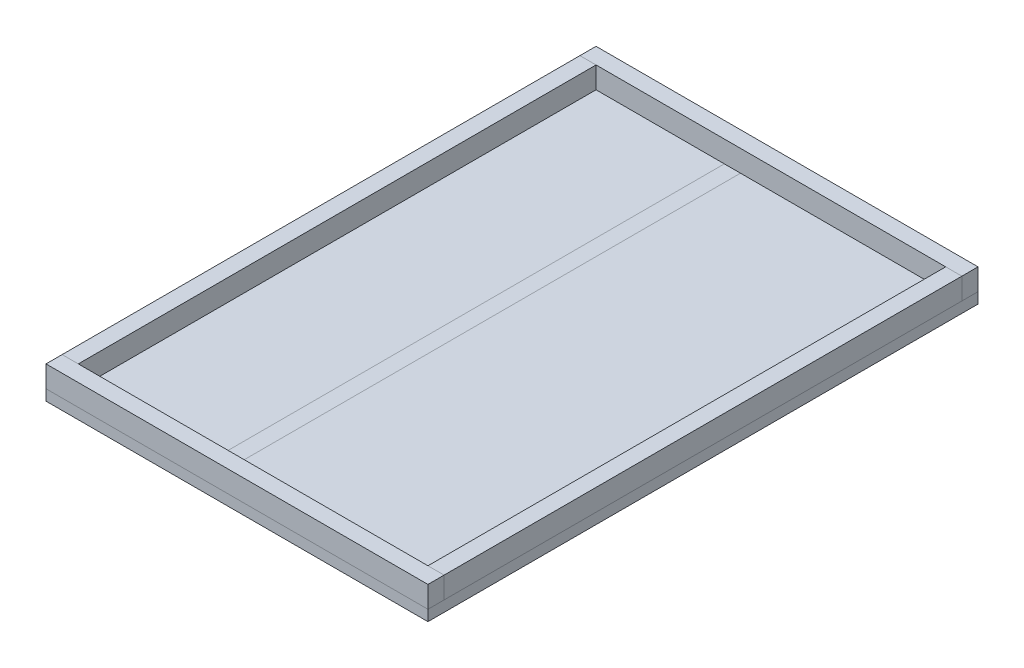
ISO-10303-21;
HEADER;
FILE_DESCRIPTION(('STEP AP214'),'2;1');
FILE_NAME('part.step','',(''),(''),'','','');
FILE_SCHEMA(('AUTOMOTIVE_DESIGN { 1 0 10303 214 1 1 1 1 }'));
ENDSEC;
DATA;
#1=APPLICATION_CONTEXT('core data for automotive mechanical design processes');
#2=APPLICATION_PROTOCOL_DEFINITION('international standard','automotive_design',2000,#1);
#3=PRODUCT_CONTEXT('',#1,'mechanical');
#4=PRODUCT('Part','Part','',(#3));
#5=PRODUCT_RELATED_PRODUCT_CATEGORY('part','',(#4));
#6=PRODUCT_DEFINITION_FORMATION('','',#4);
#7=PRODUCT_DEFINITION_CONTEXT('part definition',#1,'design');
#8=PRODUCT_DEFINITION('design','',#6,#7);
#9=PRODUCT_DEFINITION_SHAPE('','',#8);
#10=(LENGTH_UNIT() NAMED_UNIT(*) SI_UNIT(.MILLI.,.METRE.));
#11=(NAMED_UNIT(*) PLANE_ANGLE_UNIT() SI_UNIT($,.RADIAN.));
#12=(NAMED_UNIT(*) SI_UNIT($,.STERADIAN.) SOLID_ANGLE_UNIT());
#13=UNCERTAINTY_MEASURE_WITH_UNIT(LENGTH_MEASURE(1.E-05),#10,'distance_accuracy_value','');
#14=(GEOMETRIC_REPRESENTATION_CONTEXT(3) GLOBAL_UNCERTAINTY_ASSIGNED_CONTEXT((#13)) GLOBAL_UNIT_ASSIGNED_CONTEXT((#10,
#11,#12)) REPRESENTATION_CONTEXT('',''));
#15=CARTESIAN_POINT('',(0.,0.,0.));
#16=DIRECTION('',(0.,0.,1.));
#17=DIRECTION('',(1.,0.,0.));
#18=AXIS2_PLACEMENT_3D('',#15,#16,#17);
#19=CARTESIAN_POINT('',(-35.8750000000001,-9.525,305.55));
#20=DIRECTION('',(1.,0.,0.));
#21=DIRECTION('',(0.,0.,-1.));
#22=AXIS2_PLACEMENT_3D('',#19,#20,#21);
#23=PLANE('',#22);
#24=DIRECTION('',(0.,0.,-1.));
#25=VECTOR('',#24,1.);
#26=CARTESIAN_POINT('',(-35.8750000000001,0.,305.55));
#27=LINE('',#26,#25);
#28=CARTESIAN_POINT('',(-35.8750000000001,0.,305.55));
#29=VERTEX_POINT('',#28);
#30=CARTESIAN_POINT('',(-35.8750000000001,0.,-305.55));
#31=VERTEX_POINT('',#30);
#32=EDGE_CURVE('E142',#29,#31,#27,.T.);
#33=ORIENTED_EDGE('',*,*,#32,.F.);
#34=DIRECTION('',(0.,1.,0.));
#35=VECTOR('',#34,1.);
#36=CARTESIAN_POINT('',(-35.8750000000001,-9.525,305.55));
#37=LINE('',#36,#35);
#38=CARTESIAN_POINT('',(-35.8750000000001,-9.525,305.55));
#39=VERTEX_POINT('',#38);
#40=EDGE_CURVE('E13',#39,#29,#37,.T.);
#41=ORIENTED_EDGE('',*,*,#40,.F.);
#42=DIRECTION('',(0.,0.,-1.));
#43=VECTOR('',#42,1.);
#44=CARTESIAN_POINT('',(-35.8750000000001,-9.525,305.55));
#45=LINE('',#44,#43);
#46=CARTESIAN_POINT('',(-35.8750000000001,-9.525,-305.55));
#47=VERTEX_POINT('',#46);
#48=EDGE_CURVE('E136',#39,#47,#45,.T.);
#49=ORIENTED_EDGE('',*,*,#48,.T.);
#50=DIRECTION('',(0.,1.,0.));
#51=VECTOR('',#50,1.);
#52=CARTESIAN_POINT('',(-35.8750000000001,-9.525,-305.55));
#53=LINE('',#52,#51);
#54=EDGE_CURVE('E81',#47,#31,#53,.T.);
#55=ORIENTED_EDGE('',*,*,#54,.T.);
#56=EDGE_LOOP('',(#33,#41,#49,#55));
#57=FACE_BOUND('',#56,.T.);
#58=ADVANCED_FACE('F78',(#57),#23,.T.);
#59=CARTESIAN_POINT('',(-54.9250000000001,-9.525,305.55));
#60=DIRECTION('',(0.,0.,1.));
#61=DIRECTION('',(1.,0.,0.));
#62=AXIS2_PLACEMENT_3D('',#59,#60,#61);
#63=PLANE('',#62);
#64=DIRECTION('',(1.,0.,0.));
#65=VECTOR('',#64,1.);
#66=CARTESIAN_POINT('',(-54.9250000000001,0.,305.55));
#67=LINE('',#66,#65);
#68=CARTESIAN_POINT('',(-54.9250000000001,0.,305.55));
#69=VERTEX_POINT('',#68);
#70=EDGE_CURVE('E138',#69,#29,#67,.T.);
#71=ORIENTED_EDGE('',*,*,#70,.F.);
#72=DIRECTION('',(0.,1.,0.));
#73=VECTOR('',#72,1.);
#74=CARTESIAN_POINT('',(-54.9250000000001,-9.525,305.55));
#75=LINE('',#74,#73);
#76=CARTESIAN_POINT('',(-54.9250000000001,-9.525,305.55));
#77=VERTEX_POINT('',#76);
#78=EDGE_CURVE('E87',#77,#69,#75,.T.);
#79=ORIENTED_EDGE('',*,*,#78,.F.);
#80=DIRECTION('',(1.,0.,0.));
#81=VECTOR('',#80,1.);
#82=CARTESIAN_POINT('',(-54.9250000000001,-9.525,305.55));
#83=LINE('',#82,#81);
#84=EDGE_CURVE('E133',#77,#39,#83,.T.);
#85=ORIENTED_EDGE('',*,*,#84,.T.);
#86=ORIENTED_EDGE('',*,*,#40,.T.);
#87=EDGE_LOOP('',(#71,#79,#85,#86));
#88=FACE_BOUND('',#87,.T.);
#89=ADVANCED_FACE('F152',(#88),#63,.T.);
#90=CARTESIAN_POINT('',(-54.9250000000001,-9.525,305.55));
#91=DIRECTION('',(-1.,0.,0.));
#92=DIRECTION('',(0.,0.,1.));
#93=AXIS2_PLACEMENT_3D('',#90,#91,#92);
#94=PLANE('',#93);
#95=DIRECTION('',(0.,0.,1.));
#96=VECTOR('',#95,1.);
#97=CARTESIAN_POINT('',(-54.9250000000001,0.,305.55));
#98=LINE('',#97,#96);
#99=CARTESIAN_POINT('',(-54.9250000000001,0.,-305.55));
#100=VERTEX_POINT('',#99);
#101=EDGE_CURVE('E128',#100,#69,#98,.T.);
#102=ORIENTED_EDGE('',*,*,#101,.F.);
#103=DIRECTION('',(0.,1.,0.));
#104=VECTOR('',#103,1.);
#105=CARTESIAN_POINT('',(-54.9250000000001,-9.525,-305.55));
#106=LINE('',#105,#104);
#107=CARTESIAN_POINT('',(-54.9250000000001,-9.525,-305.55));
#108=VERTEX_POINT('',#107);
#109=EDGE_CURVE('E123',#108,#100,#106,.T.);
#110=ORIENTED_EDGE('',*,*,#109,.F.);
#111=DIRECTION('',(0.,0.,1.));
#112=VECTOR('',#111,1.);
#113=CARTESIAN_POINT('',(-54.9250000000001,-9.525,305.55));
#114=LINE('',#113,#112);
#115=EDGE_CURVE('E126',#108,#77,#114,.T.);
#116=ORIENTED_EDGE('',*,*,#115,.T.);
#117=ORIENTED_EDGE('',*,*,#78,.T.);
#118=EDGE_LOOP('',(#102,#110,#116,#117));
#119=FACE_BOUND('',#118,.T.);
#120=ADVANCED_FACE('F125',(#119),#94,.T.);
#121=CARTESIAN_POINT('',(-54.9250000000001,-9.525,-305.55));
#122=DIRECTION('',(0.,0.,-1.));
#123=DIRECTION('',(-1.,0.,0.));
#124=AXIS2_PLACEMENT_3D('',#121,#122,#123);
#125=PLANE('',#124);
#126=DIRECTION('',(-1.,0.,0.));
#127=VECTOR('',#126,1.);
#128=CARTESIAN_POINT('',(-54.9250000000001,0.,-305.55));
#129=LINE('',#128,#127);
#130=EDGE_CURVE('E145',#31,#100,#129,.T.);
#131=ORIENTED_EDGE('',*,*,#130,.F.);
#132=ORIENTED_EDGE('',*,*,#54,.F.);
#133=DIRECTION('',(-1.,0.,0.));
#134=VECTOR('',#133,1.);
#135=CARTESIAN_POINT('',(-54.9250000000001,-9.525,-305.55));
#136=LINE('',#135,#134);
#137=EDGE_CURVE('E132',#47,#108,#136,.T.);
#138=ORIENTED_EDGE('',*,*,#137,.T.);
#139=ORIENTED_EDGE('',*,*,#109,.T.);
#140=EDGE_LOOP('',(#131,#132,#138,#139));
#141=FACE_BOUND('',#140,.T.);
#142=ADVANCED_FACE('F135',(#141),#125,.T.);
#143=CARTESIAN_POINT('',(0.,-9.525,0.));
#144=DIRECTION('',(0.,-1.,0.));
#145=DIRECTION('',(0.,0.,-1.));
#146=AXIS2_PLACEMENT_3D('',#143,#144,#145);
#147=PLANE('',#146);
#148=ORIENTED_EDGE('',*,*,#48,.F.);
#149=ORIENTED_EDGE('',*,*,#84,.F.);
#150=ORIENTED_EDGE('',*,*,#115,.F.);
#151=ORIENTED_EDGE('',*,*,#137,.F.);
#152=EDGE_LOOP('',(#148,#149,#150,#151));
#153=FACE_BOUND('',#152,.T.);
#154=ADVANCED_FACE('F131',(#153),#147,.T.);
#155=CARTESIAN_POINT('',(0.,0.,0.));
#156=DIRECTION('',(0.,-1.,0.));
#157=DIRECTION('',(0.,0.,-1.));
#158=AXIS2_PLACEMENT_3D('',#155,#156,#157);
#159=PLANE('',#158);
#160=ORIENTED_EDGE('',*,*,#32,.T.);
#161=ORIENTED_EDGE('',*,*,#130,.T.);
#162=ORIENTED_EDGE('',*,*,#101,.T.);
#163=ORIENTED_EDGE('',*,*,#70,.T.);
#164=EDGE_LOOP('',(#160,#161,#162,#163));
#165=FACE_BOUND('',#164,.T.);
#166=ADVANCED_FACE('F151',(#165),#159,.F.);
#167=CLOSED_SHELL('',(#58,#89,#120,#142,#154,#166));
#168=MANIFOLD_SOLID_BREP('B2',#167);
#169=CARTESIAN_POINT('',(5.39999999999993,-25.4,-305.55));
#170=DIRECTION('',(-1.,0.,0.));
#171=DIRECTION('',(0.,0.,1.));
#172=AXIS2_PLACEMENT_3D('',#169,#170,#171);
#173=PLANE('',#172);
#174=DIRECTION('',(0.,0.,1.));
#175=VECTOR('',#174,1.);
#176=CARTESIAN_POINT('',(5.39999999999993,-12.7,-305.55));
#177=LINE('',#176,#175);
#178=CARTESIAN_POINT('',(5.39999999999993,-12.7,-305.55));
#179=VERTEX_POINT('',#178);
#180=CARTESIAN_POINT('',(5.39999999999993,-12.7,305.55));
#181=VERTEX_POINT('',#180);
#182=EDGE_CURVE('E277',#179,#181,#177,.T.);
#183=ORIENTED_EDGE('',*,*,#182,.T.);
#184=DIRECTION('',(0.,1.,0.));
#185=VECTOR('',#184,1.);
#186=CARTESIAN_POINT('',(5.39999999999993,-25.4,305.55));
#187=LINE('',#186,#185);
#188=CARTESIAN_POINT('',(5.39999999999993,-25.4,305.55));
#189=VERTEX_POINT('',#188);
#190=EDGE_CURVE('E76',#189,#181,#187,.T.);
#191=ORIENTED_EDGE('',*,*,#190,.F.);
#192=DIRECTION('',(0.,0.,1.));
#193=VECTOR('',#192,1.);
#194=CARTESIAN_POINT('',(5.39999999999993,-25.4,-305.55));
#195=LINE('',#194,#193);
#196=CARTESIAN_POINT('',(5.39999999999993,-25.4,-305.55));
#197=VERTEX_POINT('',#196);
#198=EDGE_CURVE('E265',#197,#189,#195,.T.);
#199=ORIENTED_EDGE('',*,*,#198,.F.);
#200=DIRECTION('',(0.,1.,0.));
#201=VECTOR('',#200,1.);
#202=CARTESIAN_POINT('',(5.39999999999993,-25.4,-305.55));
#203=LINE('',#202,#201);
#204=EDGE_CURVE('E273',#197,#179,#203,.T.);
#205=ORIENTED_EDGE('',*,*,#204,.T.);
#206=EDGE_LOOP('',(#183,#191,#199,#205));
#207=FACE_BOUND('',#206,.T.);
#208=ADVANCED_FACE('F214',(#207),#173,.F.);
#209=CARTESIAN_POINT('',(-96.2000000000001,-25.4,305.55));
#210=DIRECTION('',(0.,0.,-1.));
#211=DIRECTION('',(-1.,0.,0.));
#212=AXIS2_PLACEMENT_3D('',#209,#210,#211);
#213=PLANE('',#212);
#214=DIRECTION('',(-1.,0.,0.));
#215=VECTOR('',#214,1.);
#216=CARTESIAN_POINT('',(-96.2000000000001,-12.7,305.55));
#217=LINE('',#216,#215);
#218=CARTESIAN_POINT('',(-96.2000000000001,-12.7,305.55));
#219=VERTEX_POINT('',#218);
#220=EDGE_CURVE('E269',#181,#219,#217,.T.);
#221=ORIENTED_EDGE('',*,*,#220,.T.);
#222=DIRECTION('',(0.,1.,0.));
#223=VECTOR('',#222,1.);
#224=CARTESIAN_POINT('',(-96.2000000000001,-25.4,305.55));
#225=LINE('',#224,#223);
#226=CARTESIAN_POINT('',(-96.2000000000001,-25.4,305.55));
#227=VERTEX_POINT('',#226);
#228=EDGE_CURVE('E222',#227,#219,#225,.T.);
#229=ORIENTED_EDGE('',*,*,#228,.F.);
#230=DIRECTION('',(-1.,0.,0.));
#231=VECTOR('',#230,1.);
#232=CARTESIAN_POINT('',(-96.2000000000001,-25.4,305.55));
#233=LINE('',#232,#231);
#234=EDGE_CURVE('E260',#189,#227,#233,.T.);
#235=ORIENTED_EDGE('',*,*,#234,.F.);
#236=ORIENTED_EDGE('',*,*,#190,.T.);
#237=EDGE_LOOP('',(#221,#229,#235,#236));
#238=FACE_BOUND('',#237,.T.);
#239=ADVANCED_FACE('F268',(#238),#213,.F.);
#240=CARTESIAN_POINT('',(-96.2000000000001,-25.4,-305.55));
#241=DIRECTION('',(1.,0.,0.));
#242=DIRECTION('',(0.,0.,-1.));
#243=AXIS2_PLACEMENT_3D('',#240,#241,#242);
#244=PLANE('',#243);
#245=DIRECTION('',(0.,0.,-1.));
#246=VECTOR('',#245,1.);
#247=CARTESIAN_POINT('',(-96.2000000000001,-12.7,-305.55));
#248=LINE('',#247,#246);
#249=CARTESIAN_POINT('',(-96.2000000000001,-12.7,-305.55));
#250=VERTEX_POINT('',#249);
#251=EDGE_CURVE('E247',#219,#250,#248,.T.);
#252=ORIENTED_EDGE('',*,*,#251,.T.);
#253=DIRECTION('',(0.,1.,0.));
#254=VECTOR('',#253,1.);
#255=CARTESIAN_POINT('',(-96.2000000000001,-25.4,-305.55));
#256=LINE('',#255,#254);
#257=CARTESIAN_POINT('',(-96.2000000000001,-25.4,-305.55));
#258=VERTEX_POINT('',#257);
#259=EDGE_CURVE('E270',#258,#250,#256,.T.);
#260=ORIENTED_EDGE('',*,*,#259,.F.);
#261=DIRECTION('',(0.,0.,-1.));
#262=VECTOR('',#261,1.);
#263=CARTESIAN_POINT('',(-96.2000000000001,-25.4,-305.55));
#264=LINE('',#263,#262);
#265=EDGE_CURVE('E263',#227,#258,#264,.T.);
#266=ORIENTED_EDGE('',*,*,#265,.F.);
#267=ORIENTED_EDGE('',*,*,#228,.T.);
#268=EDGE_LOOP('',(#252,#260,#266,#267));
#269=FACE_BOUND('',#268,.T.);
#270=ADVANCED_FACE('F271',(#269),#244,.F.);
#271=CARTESIAN_POINT('',(-96.2000000000001,-25.4,-305.55));
#272=DIRECTION('',(0.,0.,1.));
#273=DIRECTION('',(1.,0.,0.));
#274=AXIS2_PLACEMENT_3D('',#271,#272,#273);
#275=PLANE('',#274);
#276=DIRECTION('',(1.,0.,0.));
#277=VECTOR('',#276,1.);
#278=CARTESIAN_POINT('',(-96.2000000000001,-12.7,-305.55));
#279=LINE('',#278,#277);
#280=EDGE_CURVE('E253',#250,#179,#279,.T.);
#281=ORIENTED_EDGE('',*,*,#280,.T.);
#282=ORIENTED_EDGE('',*,*,#204,.F.);
#283=DIRECTION('',(1.,0.,0.));
#284=VECTOR('',#283,1.);
#285=CARTESIAN_POINT('',(-96.2000000000001,-25.4,-305.55));
#286=LINE('',#285,#284);
#287=EDGE_CURVE('E230',#258,#197,#286,.T.);
#288=ORIENTED_EDGE('',*,*,#287,.F.);
#289=ORIENTED_EDGE('',*,*,#259,.T.);
#290=EDGE_LOOP('',(#281,#282,#288,#289));
#291=FACE_BOUND('',#290,.T.);
#292=ADVANCED_FACE('F284',(#291),#275,.F.);
#293=CARTESIAN_POINT('',(0.,-25.4,0.));
#294=DIRECTION('',(0.,1.,0.));
#295=DIRECTION('',(0.,0.,1.));
#296=AXIS2_PLACEMENT_3D('',#293,#294,#295);
#297=PLANE('',#296);
#298=ORIENTED_EDGE('',*,*,#198,.T.);
#299=ORIENTED_EDGE('',*,*,#234,.T.);
#300=ORIENTED_EDGE('',*,*,#265,.T.);
#301=ORIENTED_EDGE('',*,*,#287,.T.);
#302=EDGE_LOOP('',(#298,#299,#300,#301));
#303=FACE_BOUND('',#302,.T.);
#304=ADVANCED_FACE('F261',(#303),#297,.F.);
#305=CARTESIAN_POINT('',(0.,-12.7,0.));
#306=DIRECTION('',(0.,1.,0.));
#307=DIRECTION('',(0.,0.,1.));
#308=AXIS2_PLACEMENT_3D('',#305,#306,#307);
#309=PLANE('',#308);
#310=ORIENTED_EDGE('',*,*,#182,.F.);
#311=ORIENTED_EDGE('',*,*,#280,.F.);
#312=ORIENTED_EDGE('',*,*,#251,.F.);
#313=ORIENTED_EDGE('',*,*,#220,.F.);
#314=EDGE_LOOP('',(#310,#311,#312,#313));
#315=FACE_BOUND('',#314,.T.);
#316=ADVANCED_FACE('F287',(#315),#309,.T.);
#317=CLOSED_SHELL('',(#208,#239,#270,#292,#304,#316));
#318=MANIFOLD_SOLID_BREP('B7',#317);
#319=CARTESIAN_POINT('',(0.,25.4,305.55));
#320=DIRECTION('',(0.,0.,-1.));
#321=DIRECTION('',(-1.,0.,0.));
#322=AXIS2_PLACEMENT_3D('',#319,#320,#321);
#323=PLANE('',#322);
#324=DIRECTION('',(1.,0.,0.));
#325=VECTOR('',#324,1.);
#326=CARTESIAN_POINT('',(0.,0.,305.55));
#327=LINE('',#326,#325);
#328=CARTESIAN_POINT('',(-225.4,0.,305.55));
#329=VERTEX_POINT('',#328);
#330=CARTESIAN_POINT('',(225.4,0.,305.55));
#331=VERTEX_POINT('',#330);
#332=EDGE_CURVE('E411',#329,#331,#327,.T.);
#333=ORIENTED_EDGE('',*,*,#332,.F.);
#334=DIRECTION('',(0.,-1.,0.));
#335=VECTOR('',#334,1.);
#336=CARTESIAN_POINT('',(-225.4,25.4,305.55));
#337=LINE('',#336,#335);
#338=CARTESIAN_POINT('',(-225.4,25.4,305.55));
#339=VERTEX_POINT('',#338);
#340=EDGE_CURVE('E212',#339,#329,#337,.T.);
#341=ORIENTED_EDGE('',*,*,#340,.F.);
#342=DIRECTION('',(1.,0.,0.));
#343=VECTOR('',#342,1.);
#344=CARTESIAN_POINT('',(0.,25.4,305.55));
#345=LINE('',#344,#343);
#346=CARTESIAN_POINT('',(225.4,25.4,305.55));
#347=VERTEX_POINT('',#346);
#348=EDGE_CURVE('E405',#339,#347,#345,.T.);
#349=ORIENTED_EDGE('',*,*,#348,.T.);
#350=DIRECTION('',(0.,-1.,0.));
#351=VECTOR('',#350,1.);
#352=CARTESIAN_POINT('',(225.4,25.4,305.55));
#353=LINE('',#352,#351);
#354=EDGE_CURVE('E386',#347,#331,#353,.T.);
#355=ORIENTED_EDGE('',*,*,#354,.T.);
#356=EDGE_LOOP('',(#333,#341,#349,#355));
#357=FACE_BOUND('',#356,.T.);
#358=ADVANCED_FACE('F348',(#357),#323,.T.);
#359=CARTESIAN_POINT('',(-225.4,25.4,0.));
#360=DIRECTION('',(-1.,0.,0.));
#361=DIRECTION('',(0.,0.,1.));
#362=AXIS2_PLACEMENT_3D('',#359,#360,#361);
#363=PLANE('',#362);
#364=DIRECTION('',(0.,0.,-1.));
#365=VECTOR('',#364,1.);
#366=CARTESIAN_POINT('',(-225.4,0.,0.));
#367=LINE('',#366,#365);
#368=CARTESIAN_POINT('',(-225.4,0.,324.6));
#369=VERTEX_POINT('',#368);
#370=EDGE_CURVE('E399',#369,#329,#367,.T.);
#371=ORIENTED_EDGE('',*,*,#370,.F.);
#372=DIRECTION('',(0.,-1.,0.));
#373=VECTOR('',#372,1.);
#374=CARTESIAN_POINT('',(-225.4,25.4,324.6));
#375=LINE('',#374,#373);
#376=CARTESIAN_POINT('',(-225.4,25.4,324.6));
#377=VERTEX_POINT('',#376);
#378=EDGE_CURVE('E356',#377,#369,#375,.T.);
#379=ORIENTED_EDGE('',*,*,#378,.F.);
#380=DIRECTION('',(0.,0.,-1.));
#381=VECTOR('',#380,1.);
#382=CARTESIAN_POINT('',(-225.4,25.4,0.));
#383=LINE('',#382,#381);
#384=EDGE_CURVE('E397',#377,#339,#383,.T.);
#385=ORIENTED_EDGE('',*,*,#384,.T.);
#386=ORIENTED_EDGE('',*,*,#340,.T.);
#387=EDGE_LOOP('',(#371,#379,#385,#386));
#388=FACE_BOUND('',#387,.T.);
#389=ADVANCED_FACE('F395',(#388),#363,.T.);
#390=CARTESIAN_POINT('',(0.,25.4,324.6));
#391=DIRECTION('',(0.,0.,-1.));
#392=DIRECTION('',(-1.,0.,0.));
#393=AXIS2_PLACEMENT_3D('',#390,#391,#392);
#394=PLANE('',#393);
#395=DIRECTION('',(1.,0.,0.));
#396=VECTOR('',#395,1.);
#397=CARTESIAN_POINT('',(0.,0.,324.6));
#398=LINE('',#397,#396);
#399=CARTESIAN_POINT('',(225.4,0.,324.6));
#400=VERTEX_POINT('',#399);
#401=EDGE_CURVE('E379',#369,#400,#398,.T.);
#402=ORIENTED_EDGE('',*,*,#401,.T.);
#403=DIRECTION('',(0.,-1.,0.));
#404=VECTOR('',#403,1.);
#405=CARTESIAN_POINT('',(225.4,25.4,324.6));
#406=LINE('',#405,#404);
#407=CARTESIAN_POINT('',(225.4,25.4,324.6));
#408=VERTEX_POINT('',#407);
#409=EDGE_CURVE('E400',#408,#400,#406,.T.);
#410=ORIENTED_EDGE('',*,*,#409,.F.);
#411=DIRECTION('',(1.,0.,0.));
#412=VECTOR('',#411,1.);
#413=CARTESIAN_POINT('',(0.,25.4,324.6));
#414=LINE('',#413,#412);
#415=EDGE_CURVE('E401',#377,#408,#414,.T.);
#416=ORIENTED_EDGE('',*,*,#415,.F.);
#417=ORIENTED_EDGE('',*,*,#378,.T.);
#418=EDGE_LOOP('',(#402,#410,#416,#417));
#419=FACE_BOUND('',#418,.T.);
#420=ADVANCED_FACE('F402',(#419),#394,.F.);
#421=CARTESIAN_POINT('',(225.4,25.4,0.));
#422=DIRECTION('',(-1.,0.,0.));
#423=DIRECTION('',(0.,0.,1.));
#424=AXIS2_PLACEMENT_3D('',#421,#422,#423);
#425=PLANE('',#424);
#426=DIRECTION('',(0.,0.,-1.));
#427=VECTOR('',#426,1.);
#428=CARTESIAN_POINT('',(225.4,0.,0.));
#429=LINE('',#428,#427);
#430=EDGE_CURVE('E407',#400,#331,#429,.T.);
#431=ORIENTED_EDGE('',*,*,#430,.T.);
#432=ORIENTED_EDGE('',*,*,#354,.F.);
#433=DIRECTION('',(0.,0.,-1.));
#434=VECTOR('',#433,1.);
#435=CARTESIAN_POINT('',(225.4,25.4,0.));
#436=LINE('',#435,#434);
#437=EDGE_CURVE('E364',#408,#347,#436,.T.);
#438=ORIENTED_EDGE('',*,*,#437,.F.);
#439=ORIENTED_EDGE('',*,*,#409,.T.);
#440=EDGE_LOOP('',(#431,#432,#438,#439));
#441=FACE_BOUND('',#440,.T.);
#442=ADVANCED_FACE('F420',(#441),#425,.F.);
#443=CARTESIAN_POINT('',(0.,25.4,0.));
#444=DIRECTION('',(0.,1.,0.));
#445=DIRECTION('',(0.,0.,1.));
#446=AXIS2_PLACEMENT_3D('',#443,#444,#445);
#447=PLANE('',#446);
#448=ORIENTED_EDGE('',*,*,#348,.F.);
#449=ORIENTED_EDGE('',*,*,#384,.F.);
#450=ORIENTED_EDGE('',*,*,#415,.T.);
#451=ORIENTED_EDGE('',*,*,#437,.T.);
#452=EDGE_LOOP('',(#448,#449,#450,#451));
#453=FACE_BOUND('',#452,.T.);
#454=ADVANCED_FACE('F404',(#453),#447,.T.);
#455=CARTESIAN_POINT('',(0.,0.,0.));
#456=DIRECTION('',(0.,1.,0.));
#457=DIRECTION('',(0.,0.,1.));
#458=AXIS2_PLACEMENT_3D('',#455,#456,#457);
#459=PLANE('',#458);
#460=ORIENTED_EDGE('',*,*,#332,.T.);
#461=ORIENTED_EDGE('',*,*,#430,.F.);
#462=ORIENTED_EDGE('',*,*,#401,.F.);
#463=ORIENTED_EDGE('',*,*,#370,.T.);
#464=EDGE_LOOP('',(#460,#461,#462,#463));
#465=FACE_BOUND('',#464,.T.);
#466=ADVANCED_FACE('F422',(#465),#459,.F.);
#467=CLOSED_SHELL('',(#358,#389,#420,#442,#454,#466));
#468=MANIFOLD_SOLID_BREP('B70',#467);
#469=CARTESIAN_POINT('',(0.,25.4,-305.55));
#470=DIRECTION('',(0.,0.,1.));
#471=DIRECTION('',(1.,0.,0.));
#472=AXIS2_PLACEMENT_3D('',#469,#470,#471);
#473=PLANE('',#472);
#474=DIRECTION('',(-1.,0.,0.));
#475=VECTOR('',#474,1.);
#476=CARTESIAN_POINT('',(0.,0.,-305.55));
#477=LINE('',#476,#475);
#478=CARTESIAN_POINT('',(225.4,0.,-305.55));
#479=VERTEX_POINT('',#478);
#480=CARTESIAN_POINT('',(-225.4,0.,-305.55));
#481=VERTEX_POINT('',#480);
#482=EDGE_CURVE('E551',#479,#481,#477,.T.);
#483=ORIENTED_EDGE('',*,*,#482,.F.);
#484=DIRECTION('',(0.,-1.,0.));
#485=VECTOR('',#484,1.);
#486=CARTESIAN_POINT('',(225.4,25.4,-305.55));
#487=LINE('',#486,#485);
#488=CARTESIAN_POINT('',(225.4,25.4,-305.55));
#489=VERTEX_POINT('',#488);
#490=EDGE_CURVE('E346',#489,#479,#487,.T.);
#491=ORIENTED_EDGE('',*,*,#490,.F.);
#492=DIRECTION('',(-1.,0.,0.));
#493=VECTOR('',#492,1.);
#494=CARTESIAN_POINT('',(0.,25.4,-305.55));
#495=LINE('',#494,#493);
#496=CARTESIAN_POINT('',(-225.4,25.4,-305.55));
#497=VERTEX_POINT('',#496);
#498=EDGE_CURVE('E536',#489,#497,#495,.T.);
#499=ORIENTED_EDGE('',*,*,#498,.T.);
#500=DIRECTION('',(0.,-1.,0.));
#501=VECTOR('',#500,1.);
#502=CARTESIAN_POINT('',(-225.4,25.4,-305.55));
#503=LINE('',#502,#501);
#504=EDGE_CURVE('E504',#497,#481,#503,.T.);
#505=ORIENTED_EDGE('',*,*,#504,.T.);
#506=EDGE_LOOP('',(#483,#491,#499,#505));
#507=FACE_BOUND('',#506,.T.);
#508=ADVANCED_FACE('F488',(#507),#473,.T.);
#509=CARTESIAN_POINT('',(225.4,25.4,0.));
#510=DIRECTION('',(-1.,0.,0.));
#511=DIRECTION('',(0.,0.,1.));
#512=AXIS2_PLACEMENT_3D('',#509,#510,#511);
#513=PLANE('',#512);
#514=DIRECTION('',(0.,0.,-1.));
#515=VECTOR('',#514,1.);
#516=CARTESIAN_POINT('',(225.4,0.,0.));
#517=LINE('',#516,#515);
#518=CARTESIAN_POINT('',(225.4,0.,-324.6));
#519=VERTEX_POINT('',#518);
#520=EDGE_CURVE('E542',#479,#519,#517,.T.);
#521=ORIENTED_EDGE('',*,*,#520,.T.);
#522=DIRECTION('',(0.,-1.,0.));
#523=VECTOR('',#522,1.);
#524=CARTESIAN_POINT('',(225.4,25.4,-324.6));
#525=LINE('',#524,#523);
#526=CARTESIAN_POINT('',(225.4,25.4,-324.6));
#527=VERTEX_POINT('',#526);
#528=EDGE_CURVE('E496',#527,#519,#525,.T.);
#529=ORIENTED_EDGE('',*,*,#528,.F.);
#530=DIRECTION('',(0.,0.,-1.));
#531=VECTOR('',#530,1.);
#532=CARTESIAN_POINT('',(225.4,25.4,0.));
#533=LINE('',#532,#531);
#534=EDGE_CURVE('E530',#489,#527,#533,.T.);
#535=ORIENTED_EDGE('',*,*,#534,.F.);
#536=ORIENTED_EDGE('',*,*,#490,.T.);
#537=EDGE_LOOP('',(#521,#529,#535,#536));
#538=FACE_BOUND('',#537,.T.);
#539=ADVANCED_FACE('F540',(#538),#513,.F.);
#540=CARTESIAN_POINT('',(0.,25.4,-324.6));
#541=DIRECTION('',(0.,0.,-1.));
#542=DIRECTION('',(-1.,0.,0.));
#543=AXIS2_PLACEMENT_3D('',#540,#541,#542);
#544=PLANE('',#543);
#545=DIRECTION('',(1.,0.,0.));
#546=VECTOR('',#545,1.);
#547=CARTESIAN_POINT('',(0.,0.,-324.6));
#548=LINE('',#547,#546);
#549=CARTESIAN_POINT('',(-225.4,0.,-324.6));
#550=VERTEX_POINT('',#549);
#551=EDGE_CURVE('E554',#550,#519,#548,.T.);
#552=ORIENTED_EDGE('',*,*,#551,.F.);
#553=DIRECTION('',(0.,-1.,0.));
#554=VECTOR('',#553,1.);
#555=CARTESIAN_POINT('',(-225.4,25.4,-324.6));
#556=LINE('',#555,#554);
#557=CARTESIAN_POINT('',(-225.4,25.4,-324.6));
#558=VERTEX_POINT('',#557);
#559=EDGE_CURVE('E517',#558,#550,#556,.T.);
#560=ORIENTED_EDGE('',*,*,#559,.F.);
#561=DIRECTION('',(1.,0.,0.));
#562=VECTOR('',#561,1.);
#563=CARTESIAN_POINT('',(0.,25.4,-324.6));
#564=LINE('',#563,#562);
#565=EDGE_CURVE('E535',#558,#527,#564,.T.);
#566=ORIENTED_EDGE('',*,*,#565,.T.);
#567=ORIENTED_EDGE('',*,*,#528,.T.);
#568=EDGE_LOOP('',(#552,#560,#566,#567));
#569=FACE_BOUND('',#568,.T.);
#570=ADVANCED_FACE('F545',(#569),#544,.T.);
#571=CARTESIAN_POINT('',(-225.4,25.4,0.));
#572=DIRECTION('',(-1.,0.,0.));
#573=DIRECTION('',(0.,0.,1.));
#574=AXIS2_PLACEMENT_3D('',#571,#572,#573);
#575=PLANE('',#574);
#576=DIRECTION('',(0.,0.,-1.));
#577=VECTOR('',#576,1.);
#578=CARTESIAN_POINT('',(-225.4,0.,0.));
#579=LINE('',#578,#577);
#580=EDGE_CURVE('E556',#481,#550,#579,.T.);
#581=ORIENTED_EDGE('',*,*,#580,.F.);
#582=ORIENTED_EDGE('',*,*,#504,.F.);
#583=DIRECTION('',(0.,0.,-1.));
#584=VECTOR('',#583,1.);
#585=CARTESIAN_POINT('',(-225.4,25.4,0.));
#586=LINE('',#585,#584);
#587=EDGE_CURVE('E546',#497,#558,#586,.T.);
#588=ORIENTED_EDGE('',*,*,#587,.T.);
#589=ORIENTED_EDGE('',*,*,#559,.T.);
#590=EDGE_LOOP('',(#581,#582,#588,#589));
#591=FACE_BOUND('',#590,.T.);
#592=ADVANCED_FACE('F561',(#591),#575,.T.);
#593=CARTESIAN_POINT('',(0.,25.4,0.));
#594=DIRECTION('',(0.,1.,0.));
#595=DIRECTION('',(0.,0.,1.));
#596=AXIS2_PLACEMENT_3D('',#593,#594,#595);
#597=PLANE('',#596);
#598=ORIENTED_EDGE('',*,*,#498,.F.);
#599=ORIENTED_EDGE('',*,*,#534,.T.);
#600=ORIENTED_EDGE('',*,*,#565,.F.);
#601=ORIENTED_EDGE('',*,*,#587,.F.);
#602=EDGE_LOOP('',(#598,#599,#600,#601));
#603=FACE_BOUND('',#602,.T.);
#604=ADVANCED_FACE('F532',(#603),#597,.T.);
#605=CARTESIAN_POINT('',(0.,0.,0.));
#606=DIRECTION('',(0.,1.,0.));
#607=DIRECTION('',(0.,0.,1.));
#608=AXIS2_PLACEMENT_3D('',#605,#606,#607);
#609=PLANE('',#608);
#610=ORIENTED_EDGE('',*,*,#482,.T.);
#611=ORIENTED_EDGE('',*,*,#580,.T.);
#612=ORIENTED_EDGE('',*,*,#551,.T.);
#613=ORIENTED_EDGE('',*,*,#520,.F.);
#614=EDGE_LOOP('',(#610,#611,#612,#613));
#615=FACE_BOUND('',#614,.T.);
#616=ADVANCED_FACE('F568',(#615),#609,.F.);
#617=CLOSED_SHELL('',(#508,#539,#570,#592,#604,#616));
#618=MANIFOLD_SOLID_BREP('B206',#617);
#619=CARTESIAN_POINT('',(206.35,25.4,0.));
#620=DIRECTION('',(-1.,0.,0.));
#621=DIRECTION('',(0.,0.,1.));
#622=AXIS2_PLACEMENT_3D('',#619,#620,#621);
#623=PLANE('',#622);
#624=DIRECTION('',(0.,0.,-1.));
#625=VECTOR('',#624,1.);
#626=CARTESIAN_POINT('',(206.35,0.,0.));
#627=LINE('',#626,#625);
#628=CARTESIAN_POINT('',(206.35,0.,305.55));
#629=VERTEX_POINT('',#628);
#630=CARTESIAN_POINT('',(206.35,0.,-305.55));
#631=VERTEX_POINT('',#630);
#632=EDGE_CURVE('E691',#629,#631,#627,.T.);
#633=ORIENTED_EDGE('',*,*,#632,.F.);
#634=DIRECTION('',(0.,-1.,0.));
#635=VECTOR('',#634,1.);
#636=CARTESIAN_POINT('',(206.35,25.4,305.55));
#637=LINE('',#636,#635);
#638=CARTESIAN_POINT('',(206.35,25.4,305.55));
#639=VERTEX_POINT('',#638);
#640=EDGE_CURVE('E486',#639,#629,#637,.T.);
#641=ORIENTED_EDGE('',*,*,#640,.F.);
#642=DIRECTION('',(0.,0.,-1.));
#643=VECTOR('',#642,1.);
#644=CARTESIAN_POINT('',(206.35,25.4,0.));
#645=LINE('',#644,#643);
#646=CARTESIAN_POINT('',(206.35,25.4,-305.55));
#647=VERTEX_POINT('',#646);
#648=EDGE_CURVE('E676',#639,#647,#645,.T.);
#649=ORIENTED_EDGE('',*,*,#648,.T.);
#650=DIRECTION('',(0.,-1.,0.));
#651=VECTOR('',#650,1.);
#652=CARTESIAN_POINT('',(206.35,25.4,-305.55));
#653=LINE('',#652,#651);
#654=EDGE_CURVE('E644',#647,#631,#653,.T.);
#655=ORIENTED_EDGE('',*,*,#654,.T.);
#656=EDGE_LOOP('',(#633,#641,#649,#655));
#657=FACE_BOUND('',#656,.T.);
#658=ADVANCED_FACE('F628',(#657),#623,.T.);
#659=CARTESIAN_POINT('',(0.,25.4,305.55));
#660=DIRECTION('',(0.,0.,-1.));
#661=DIRECTION('',(-1.,0.,0.));
#662=AXIS2_PLACEMENT_3D('',#659,#660,#661);
#663=PLANE('',#662);
#664=DIRECTION('',(1.,0.,0.));
#665=VECTOR('',#664,1.);
#666=CARTESIAN_POINT('',(0.,0.,305.55));
#667=LINE('',#666,#665);
#668=CARTESIAN_POINT('',(225.4,0.,305.55));
#669=VERTEX_POINT('',#668);
#670=EDGE_CURVE('E682',#629,#669,#667,.T.);
#671=ORIENTED_EDGE('',*,*,#670,.T.);
#672=DIRECTION('',(0.,-1.,0.));
#673=VECTOR('',#672,1.);
#674=CARTESIAN_POINT('',(225.4,25.4,305.55));
#675=LINE('',#674,#673);
#676=CARTESIAN_POINT('',(225.4,25.4,305.55));
#677=VERTEX_POINT('',#676);
#678=EDGE_CURVE('E636',#677,#669,#675,.T.);
#679=ORIENTED_EDGE('',*,*,#678,.F.);
#680=DIRECTION('',(1.,0.,0.));
#681=VECTOR('',#680,1.);
#682=CARTESIAN_POINT('',(0.,25.4,305.55));
#683=LINE('',#682,#681);
#684=EDGE_CURVE('E670',#639,#677,#683,.T.);
#685=ORIENTED_EDGE('',*,*,#684,.F.);
#686=ORIENTED_EDGE('',*,*,#640,.T.);
#687=EDGE_LOOP('',(#671,#679,#685,#686));
#688=FACE_BOUND('',#687,.T.);
#689=ADVANCED_FACE('F680',(#688),#663,.F.);
#690=CARTESIAN_POINT('',(225.4,25.4,0.));
#691=DIRECTION('',(-1.,0.,0.));
#692=DIRECTION('',(0.,0.,1.));
#693=AXIS2_PLACEMENT_3D('',#690,#691,#692);
#694=PLANE('',#693);
#695=DIRECTION('',(0.,0.,-1.));
#696=VECTOR('',#695,1.);
#697=CARTESIAN_POINT('',(225.4,0.,0.));
#698=LINE('',#697,#696);
#699=CARTESIAN_POINT('',(225.4,0.,-305.55));
#700=VERTEX_POINT('',#699);
#701=EDGE_CURVE('E694',#669,#700,#698,.T.);
#702=ORIENTED_EDGE('',*,*,#701,.T.);
#703=DIRECTION('',(0.,-1.,0.));
#704=VECTOR('',#703,1.);
#705=CARTESIAN_POINT('',(225.4,25.4,-305.55));
#706=LINE('',#705,#704);
#707=CARTESIAN_POINT('',(225.4,25.4,-305.55));
#708=VERTEX_POINT('',#707);
#709=EDGE_CURVE('E658',#708,#700,#706,.T.);
#710=ORIENTED_EDGE('',*,*,#709,.F.);
#711=DIRECTION('',(0.,0.,-1.));
#712=VECTOR('',#711,1.);
#713=CARTESIAN_POINT('',(225.4,25.4,0.));
#714=LINE('',#713,#712);
#715=EDGE_CURVE('E675',#677,#708,#714,.T.);
#716=ORIENTED_EDGE('',*,*,#715,.F.);
#717=ORIENTED_EDGE('',*,*,#678,.T.);
#718=EDGE_LOOP('',(#702,#710,#716,#717));
#719=FACE_BOUND('',#718,.T.);
#720=ADVANCED_FACE('F685',(#719),#694,.F.);
#721=CARTESIAN_POINT('',(0.,25.4,-305.55));
#722=DIRECTION('',(0.,0.,-1.));
#723=DIRECTION('',(-1.,0.,0.));
#724=AXIS2_PLACEMENT_3D('',#721,#722,#723);
#725=PLANE('',#724);
#726=DIRECTION('',(1.,0.,0.));
#727=VECTOR('',#726,1.);
#728=CARTESIAN_POINT('',(0.,0.,-305.55));
#729=LINE('',#728,#727);
#730=EDGE_CURVE('E696',#631,#700,#729,.T.);
#731=ORIENTED_EDGE('',*,*,#730,.F.);
#732=ORIENTED_EDGE('',*,*,#654,.F.);
#733=DIRECTION('',(1.,0.,0.));
#734=VECTOR('',#733,1.);
#735=CARTESIAN_POINT('',(0.,25.4,-305.55));
#736=LINE('',#735,#734);
#737=EDGE_CURVE('E686',#647,#708,#736,.T.);
#738=ORIENTED_EDGE('',*,*,#737,.T.);
#739=ORIENTED_EDGE('',*,*,#709,.T.);
#740=EDGE_LOOP('',(#731,#732,#738,#739));
#741=FACE_BOUND('',#740,.T.);
#742=ADVANCED_FACE('F701',(#741),#725,.T.);
#743=CARTESIAN_POINT('',(0.,25.4,0.));
#744=DIRECTION('',(0.,1.,0.));
#745=DIRECTION('',(0.,0.,1.));
#746=AXIS2_PLACEMENT_3D('',#743,#744,#745);
#747=PLANE('',#746);
#748=ORIENTED_EDGE('',*,*,#648,.F.);
#749=ORIENTED_EDGE('',*,*,#684,.T.);
#750=ORIENTED_EDGE('',*,*,#715,.T.);
#751=ORIENTED_EDGE('',*,*,#737,.F.);
#752=EDGE_LOOP('',(#748,#749,#750,#751));
#753=FACE_BOUND('',#752,.T.);
#754=ADVANCED_FACE('F672',(#753),#747,.T.);
#755=CARTESIAN_POINT('',(0.,0.,0.));
#756=DIRECTION('',(0.,1.,0.));
#757=DIRECTION('',(0.,0.,1.));
#758=AXIS2_PLACEMENT_3D('',#755,#756,#757);
#759=PLANE('',#758);
#760=ORIENTED_EDGE('',*,*,#632,.T.);
#761=ORIENTED_EDGE('',*,*,#730,.T.);
#762=ORIENTED_EDGE('',*,*,#701,.F.);
#763=ORIENTED_EDGE('',*,*,#670,.F.);
#764=EDGE_LOOP('',(#760,#761,#762,#763));
#765=FACE_BOUND('',#764,.T.);
#766=ADVANCED_FACE('F708',(#765),#759,.F.);
#767=CLOSED_SHELL('',(#658,#689,#720,#742,#754,#766));
#768=MANIFOLD_SOLID_BREP('B340',#767);
#769=CARTESIAN_POINT('',(0.,25.4,305.55));
#770=DIRECTION('',(0.,0.,1.));
#771=DIRECTION('',(1.,0.,0.));
#772=AXIS2_PLACEMENT_3D('',#769,#770,#771);
#773=PLANE('',#772);
#774=DIRECTION('',(-1.,0.,0.));
#775=VECTOR('',#774,1.);
#776=CARTESIAN_POINT('',(0.,0.,305.55));
#777=LINE('',#776,#775);
#778=CARTESIAN_POINT('',(-206.35,0.,305.55));
#779=VERTEX_POINT('',#778);
#780=CARTESIAN_POINT('',(-225.4,0.,305.55));
#781=VERTEX_POINT('',#780);
#782=EDGE_CURVE('E824',#779,#781,#777,.T.);
#783=ORIENTED_EDGE('',*,*,#782,.F.);
#784=DIRECTION('',(0.,-1.,0.));
#785=VECTOR('',#784,1.);
#786=CARTESIAN_POINT('',(-206.35,25.4,305.55));
#787=LINE('',#786,#785);
#788=CARTESIAN_POINT('',(-206.35,25.4,305.55));
#789=VERTEX_POINT('',#788);
#790=EDGE_CURVE('E626',#789,#779,#787,.T.);
#791=ORIENTED_EDGE('',*,*,#790,.F.);
#792=DIRECTION('',(-1.,0.,0.));
#793=VECTOR('',#792,1.);
#794=CARTESIAN_POINT('',(0.,25.4,305.55));
#795=LINE('',#794,#793);
#796=CARTESIAN_POINT('',(-225.4,25.4,305.55));
#797=VERTEX_POINT('',#796);
#798=EDGE_CURVE('E809',#789,#797,#795,.T.);
#799=ORIENTED_EDGE('',*,*,#798,.T.);
#800=DIRECTION('',(0.,-1.,0.));
#801=VECTOR('',#800,1.);
#802=CARTESIAN_POINT('',(-225.4,25.4,305.55));
#803=LINE('',#802,#801);
#804=EDGE_CURVE('E777',#797,#781,#803,.T.);
#805=ORIENTED_EDGE('',*,*,#804,.T.);
#806=EDGE_LOOP('',(#783,#791,#799,#805));
#807=FACE_BOUND('',#806,.T.);
#808=ADVANCED_FACE('F761',(#807),#773,.T.);
#809=CARTESIAN_POINT('',(-206.35,25.4,0.));
#810=DIRECTION('',(-1.,0.,0.));
#811=DIRECTION('',(0.,0.,1.));
#812=AXIS2_PLACEMENT_3D('',#809,#810,#811);
#813=PLANE('',#812);
#814=DIRECTION('',(0.,0.,-1.));
#815=VECTOR('',#814,1.);
#816=CARTESIAN_POINT('',(-206.35,0.,0.));
#817=LINE('',#816,#815);
#818=CARTESIAN_POINT('',(-206.35,0.,-305.55));
#819=VERTEX_POINT('',#818);
#820=EDGE_CURVE('E815',#779,#819,#817,.T.);
#821=ORIENTED_EDGE('',*,*,#820,.T.);
#822=DIRECTION('',(0.,-1.,0.));
#823=VECTOR('',#822,1.);
#824=CARTESIAN_POINT('',(-206.35,25.4,-305.55));
#825=LINE('',#824,#823);
#826=CARTESIAN_POINT('',(-206.35,25.4,-305.55));
#827=VERTEX_POINT('',#826);
#828=EDGE_CURVE('E769',#827,#819,#825,.T.);
#829=ORIENTED_EDGE('',*,*,#828,.F.);
#830=DIRECTION('',(0.,0.,-1.));
#831=VECTOR('',#830,1.);
#832=CARTESIAN_POINT('',(-206.35,25.4,0.));
#833=LINE('',#832,#831);
#834=EDGE_CURVE('E803',#789,#827,#833,.T.);
#835=ORIENTED_EDGE('',*,*,#834,.F.);
#836=ORIENTED_EDGE('',*,*,#790,.T.);
#837=EDGE_LOOP('',(#821,#829,#835,#836));
#838=FACE_BOUND('',#837,.T.);
#839=ADVANCED_FACE('F813',(#838),#813,.F.);
#840=CARTESIAN_POINT('',(0.,25.4,-305.55));
#841=DIRECTION('',(0.,0.,1.));
#842=DIRECTION('',(1.,0.,0.));
#843=AXIS2_PLACEMENT_3D('',#840,#841,#842);
#844=PLANE('',#843);
#845=DIRECTION('',(-1.,0.,0.));
#846=VECTOR('',#845,1.);
#847=CARTESIAN_POINT('',(0.,0.,-305.55));
#848=LINE('',#847,#846);
#849=CARTESIAN_POINT('',(-225.4,0.,-305.55));
#850=VERTEX_POINT('',#849);
#851=EDGE_CURVE('E827',#819,#850,#848,.T.);
#852=ORIENTED_EDGE('',*,*,#851,.T.);
#853=DIRECTION('',(0.,-1.,0.));
#854=VECTOR('',#853,1.);
#855=CARTESIAN_POINT('',(-225.4,25.4,-305.55));
#856=LINE('',#855,#854);
#857=CARTESIAN_POINT('',(-225.4,25.4,-305.55));
#858=VERTEX_POINT('',#857);
#859=EDGE_CURVE('E791',#858,#850,#856,.T.);
#860=ORIENTED_EDGE('',*,*,#859,.F.);
#861=DIRECTION('',(-1.,0.,0.));
#862=VECTOR('',#861,1.);
#863=CARTESIAN_POINT('',(0.,25.4,-305.55));
#864=LINE('',#863,#862);
#865=EDGE_CURVE('E808',#827,#858,#864,.T.);
#866=ORIENTED_EDGE('',*,*,#865,.F.);
#867=ORIENTED_EDGE('',*,*,#828,.T.);
#868=EDGE_LOOP('',(#852,#860,#866,#867));
#869=FACE_BOUND('',#868,.T.);
#870=ADVANCED_FACE('F818',(#869),#844,.F.);
#871=CARTESIAN_POINT('',(-225.4,25.4,0.));
#872=DIRECTION('',(-1.,0.,0.));
#873=DIRECTION('',(0.,0.,1.));
#874=AXIS2_PLACEMENT_3D('',#871,#872,#873);
#875=PLANE('',#874);
#876=DIRECTION('',(0.,0.,-1.));
#877=VECTOR('',#876,1.);
#878=CARTESIAN_POINT('',(-225.4,0.,0.));
#879=LINE('',#878,#877);
#880=EDGE_CURVE('E829',#781,#850,#879,.T.);
#881=ORIENTED_EDGE('',*,*,#880,.F.);
#882=ORIENTED_EDGE('',*,*,#804,.F.);
#883=DIRECTION('',(0.,0.,-1.));
#884=VECTOR('',#883,1.);
#885=CARTESIAN_POINT('',(-225.4,25.4,0.));
#886=LINE('',#885,#884);
#887=EDGE_CURVE('E819',#797,#858,#886,.T.);
#888=ORIENTED_EDGE('',*,*,#887,.T.);
#889=ORIENTED_EDGE('',*,*,#859,.T.);
#890=EDGE_LOOP('',(#881,#882,#888,#889));
#891=FACE_BOUND('',#890,.T.);
#892=ADVANCED_FACE('F834',(#891),#875,.T.);
#893=CARTESIAN_POINT('',(0.,25.4,0.));
#894=DIRECTION('',(0.,1.,0.));
#895=DIRECTION('',(0.,0.,1.));
#896=AXIS2_PLACEMENT_3D('',#893,#894,#895);
#897=PLANE('',#896);
#898=ORIENTED_EDGE('',*,*,#798,.F.);
#899=ORIENTED_EDGE('',*,*,#834,.T.);
#900=ORIENTED_EDGE('',*,*,#865,.T.);
#901=ORIENTED_EDGE('',*,*,#887,.F.);
#902=EDGE_LOOP('',(#898,#899,#900,#901));
#903=FACE_BOUND('',#902,.T.);
#904=ADVANCED_FACE('F805',(#903),#897,.T.);
#905=CARTESIAN_POINT('',(0.,0.,0.));
#906=DIRECTION('',(0.,1.,0.));
#907=DIRECTION('',(0.,0.,1.));
#908=AXIS2_PLACEMENT_3D('',#905,#906,#907);
#909=PLANE('',#908);
#910=ORIENTED_EDGE('',*,*,#782,.T.);
#911=ORIENTED_EDGE('',*,*,#880,.T.);
#912=ORIENTED_EDGE('',*,*,#851,.F.);
#913=ORIENTED_EDGE('',*,*,#820,.F.);
#914=EDGE_LOOP('',(#910,#911,#912,#913));
#915=FACE_BOUND('',#914,.T.);
#916=ADVANCED_FACE('F841',(#915),#909,.F.);
#917=CLOSED_SHELL('',(#808,#839,#870,#892,#904,#916));
#918=MANIFOLD_SOLID_BREP('B480',#917);
#919=CARTESIAN_POINT('',(0.,-12.7,324.6));
#920=DIRECTION('',(0.,0.,1.));
#921=DIRECTION('',(1.,0.,0.));
#922=AXIS2_PLACEMENT_3D('',#919,#920,#921);
#923=PLANE('',#922);
#924=DIRECTION('',(1.,0.,0.));
#925=VECTOR('',#924,1.);
#926=CARTESIAN_POINT('',(0.,0.,324.6));
#927=LINE('',#926,#925);
#928=CARTESIAN_POINT('',(-225.4,0.,324.6));
#929=VERTEX_POINT('',#928);
#930=CARTESIAN_POINT('',(225.4,0.,324.6));
#931=VERTEX_POINT('',#930);
#932=EDGE_CURVE('E994',#929,#931,#927,.T.);
#933=ORIENTED_EDGE('',*,*,#932,.F.);
#934=DIRECTION('',(0.,1.,0.));
#935=VECTOR('',#934,1.);
#936=CARTESIAN_POINT('',(-225.4,-12.7,324.6));
#937=LINE('',#936,#935);
#938=CARTESIAN_POINT('',(-225.4,-12.7,324.6));
#939=VERTEX_POINT('',#938);
#940=EDGE_CURVE('E759',#939,#929,#937,.T.);
#941=ORIENTED_EDGE('',*,*,#940,.F.);
#942=DIRECTION('',(1.,0.,0.));
#943=VECTOR('',#942,1.);
#944=CARTESIAN_POINT('',(0.,-12.7,324.6));
#945=LINE('',#944,#943);
#946=CARTESIAN_POINT('',(225.4,-12.7,324.6));
#947=VERTEX_POINT('',#946);
#948=EDGE_CURVE('E1000',#939,#947,#945,.T.);
#949=ORIENTED_EDGE('',*,*,#948,.T.);
#950=DIRECTION('',(0.,1.,0.));
#951=VECTOR('',#950,1.);
#952=CARTESIAN_POINT('',(225.4,-12.7,324.6));
#953=LINE('',#952,#951);
#954=EDGE_CURVE('E888',#947,#931,#953,.T.);
#955=ORIENTED_EDGE('',*,*,#954,.T.);
#956=EDGE_LOOP('',(#933,#941,#949,#955));
#957=FACE_BOUND('',#956,.T.);
#958=ADVANCED_FACE('F885',(#957),#923,.T.);
#959=CARTESIAN_POINT('',(0.,0.,0.));
#960=DIRECTION('',(0.,1.,0.));
#961=DIRECTION('',(0.,0.,1.));
#962=AXIS2_PLACEMENT_3D('',#959,#960,#961);
#963=PLANE('',#962);
#964=DIRECTION('',(0.,0.,-1.));
#965=VECTOR('',#964,1.);
#966=CARTESIAN_POINT('',(-35.8750000000001,0.,305.55));
#967=LINE('',#966,#965);
#968=CARTESIAN_POINT('',(-35.8750000000001,0.,305.55));
#969=VERTEX_POINT('',#968);
#970=CARTESIAN_POINT('',(-35.8750000000001,0.,-305.55));
#971=VERTEX_POINT('',#970);
#972=EDGE_CURVE('E902',#969,#971,#967,.T.);
#973=ORIENTED_EDGE('',*,*,#972,.F.);
#974=DIRECTION('',(1.,0.,0.));
#975=VECTOR('',#974,1.);
#976=CARTESIAN_POINT('',(-54.9250000000001,0.,305.55));
#977=LINE('',#976,#975);
#978=CARTESIAN_POINT('',(-54.9250000000001,0.,305.55));
#979=VERTEX_POINT('',#978);
#980=EDGE_CURVE('E972',#979,#969,#977,.T.);
#981=ORIENTED_EDGE('',*,*,#980,.F.);
#982=DIRECTION('',(0.,0.,1.));
#983=VECTOR('',#982,1.);
#984=CARTESIAN_POINT('',(-54.9250000000001,0.,305.55));
#985=LINE('',#984,#983);
#986=CARTESIAN_POINT('',(-54.9250000000001,0.,-305.55));
#987=VERTEX_POINT('',#986);
#988=EDGE_CURVE('E976',#987,#979,#985,.T.);
#989=ORIENTED_EDGE('',*,*,#988,.F.);
#990=DIRECTION('',(-1.,0.,0.));
#991=VECTOR('',#990,1.);
#992=CARTESIAN_POINT('',(-54.9250000000001,0.,-305.55));
#993=LINE('',#992,#991);
#994=EDGE_CURVE('E985',#971,#987,#993,.T.);
#995=ORIENTED_EDGE('',*,*,#994,.F.);
#996=EDGE_LOOP('',(#973,#981,#989,#995));
#997=FACE_BOUND('',#996,.T.);
#998=ORIENTED_EDGE('',*,*,#932,.T.);
#999=DIRECTION('',(0.,0.,-1.));
#1000=VECTOR('',#999,1.);
#1001=CARTESIAN_POINT('',(225.4,0.,0.));
#1002=LINE('',#1001,#1000);
#1003=CARTESIAN_POINT('',(225.4,0.,-324.6));
#1004=VERTEX_POINT('',#1003);
#1005=EDGE_CURVE('E1018',#931,#1004,#1002,.T.);
#1006=ORIENTED_EDGE('',*,*,#1005,.T.);
#1007=DIRECTION('',(1.,0.,0.));
#1008=VECTOR('',#1007,1.);
#1009=CARTESIAN_POINT('',(0.,0.,-324.6));
#1010=LINE('',#1009,#1008);
#1011=CARTESIAN_POINT('',(-225.4,0.,-324.6));
#1012=VERTEX_POINT('',#1011);
#1013=EDGE_CURVE('E1022',#1012,#1004,#1010,.T.);
#1014=ORIENTED_EDGE('',*,*,#1013,.F.);
#1015=DIRECTION('',(0.,0.,-1.));
#1016=VECTOR('',#1015,1.);
#1017=CARTESIAN_POINT('',(-225.4,0.,0.));
#1018=LINE('',#1017,#1016);
#1019=EDGE_CURVE('E1005',#929,#1012,#1018,.T.);
#1020=ORIENTED_EDGE('',*,*,#1019,.F.);
#1021=EDGE_LOOP('',(#998,#1006,#1014,#1020));
#1022=FACE_BOUND('',#1021,.T.);
#1023=ADVANCED_FACE('F1044',(#997,#1022),#963,.T.);
#1024=CARTESIAN_POINT('',(225.4,-12.7,0.));
#1025=DIRECTION('',(1.,0.,0.));
#1026=DIRECTION('',(0.,0.,-1.));
#1027=AXIS2_PLACEMENT_3D('',#1024,#1025,#1026);
#1028=PLANE('',#1027);
#1029=ORIENTED_EDGE('',*,*,#1005,.F.);
#1030=ORIENTED_EDGE('',*,*,#954,.F.);
#1031=DIRECTION('',(0.,0.,-1.));
#1032=VECTOR('',#1031,1.);
#1033=CARTESIAN_POINT('',(225.4,-12.7,0.));
#1034=LINE('',#1033,#1032);
#1035=CARTESIAN_POINT('',(225.4,-12.7,-324.6));
#1036=VERTEX_POINT('',#1035);
#1037=EDGE_CURVE('E1004',#947,#1036,#1034,.T.);
#1038=ORIENTED_EDGE('',*,*,#1037,.T.);
#1039=DIRECTION('',(0.,1.,0.));
#1040=VECTOR('',#1039,1.);
#1041=CARTESIAN_POINT('',(225.4,-12.7,-324.6));
#1042=LINE('',#1041,#1040);
#1043=EDGE_CURVE('E1030',#1036,#1004,#1042,.T.);
#1044=ORIENTED_EDGE('',*,*,#1043,.T.);
#1045=EDGE_LOOP('',(#1029,#1030,#1038,#1044));
#1046=FACE_BOUND('',#1045,.T.);
#1047=ADVANCED_FACE('F1040',(#1046),#1028,.T.);
#1048=CARTESIAN_POINT('',(0.,-12.7,-324.6));
#1049=DIRECTION('',(0.,0.,1.));
#1050=DIRECTION('',(1.,0.,0.));
#1051=AXIS2_PLACEMENT_3D('',#1048,#1049,#1050);
#1052=PLANE('',#1051);
#1053=ORIENTED_EDGE('',*,*,#1013,.T.);
#1054=ORIENTED_EDGE('',*,*,#1043,.F.);
#1055=DIRECTION('',(1.,0.,0.));
#1056=VECTOR('',#1055,1.);
#1057=CARTESIAN_POINT('',(0.,-12.7,-324.6));
#1058=LINE('',#1057,#1056);
#1059=CARTESIAN_POINT('',(-225.4,-12.7,-324.6));
#1060=VERTEX_POINT('',#1059);
#1061=EDGE_CURVE('E1009',#1060,#1036,#1058,.T.);
#1062=ORIENTED_EDGE('',*,*,#1061,.F.);
#1063=DIRECTION('',(0.,1.,0.));
#1064=VECTOR('',#1063,1.);
#1065=CARTESIAN_POINT('',(-225.4,-12.7,-324.6));
#1066=LINE('',#1065,#1064);
#1067=EDGE_CURVE('E894',#1060,#1012,#1066,.T.);
#1068=ORIENTED_EDGE('',*,*,#1067,.T.);
#1069=EDGE_LOOP('',(#1053,#1054,#1062,#1068));
#1070=FACE_BOUND('',#1069,.T.);
#1071=ADVANCED_FACE('F1051',(#1070),#1052,.F.);
#1072=CARTESIAN_POINT('',(-225.4,-12.7,0.));
#1073=DIRECTION('',(1.,0.,0.));
#1074=DIRECTION('',(0.,0.,-1.));
#1075=AXIS2_PLACEMENT_3D('',#1072,#1073,#1074);
#1076=PLANE('',#1075);
#1077=ORIENTED_EDGE('',*,*,#1019,.T.);
#1078=ORIENTED_EDGE('',*,*,#1067,.F.);
#1079=DIRECTION('',(0.,0.,-1.));
#1080=VECTOR('',#1079,1.);
#1081=CARTESIAN_POINT('',(-225.4,-12.7,0.));
#1082=LINE('',#1081,#1080);
#1083=EDGE_CURVE('E1012',#939,#1060,#1082,.T.);
#1084=ORIENTED_EDGE('',*,*,#1083,.F.);
#1085=ORIENTED_EDGE('',*,*,#940,.T.);
#1086=EDGE_LOOP('',(#1077,#1078,#1084,#1085));
#1087=FACE_BOUND('',#1086,.T.);
#1088=ADVANCED_FACE('F1047',(#1087),#1076,.F.);
#1089=CARTESIAN_POINT('',(0.,-12.7,0.));
#1090=DIRECTION('',(0.,1.,0.));
#1091=DIRECTION('',(0.,0.,1.));
#1092=AXIS2_PLACEMENT_3D('',#1089,#1090,#1091);
#1093=PLANE('',#1092);
#1094=DIRECTION('',(1.,0.,0.));
#1095=VECTOR('',#1094,1.);
#1096=CARTESIAN_POINT('',(-54.9250000000001,-12.7,305.55));
#1097=LINE('',#1096,#1095);
#1098=CARTESIAN_POINT('',(-54.9250000000001,-12.7,305.55));
#1099=VERTEX_POINT('',#1098);
#1100=CARTESIAN_POINT('',(-35.8750000000001,-12.7,305.55));
#1101=VERTEX_POINT('',#1100);
#1102=EDGE_CURVE('E960',#1099,#1101,#1097,.T.);
#1103=ORIENTED_EDGE('',*,*,#1102,.T.);
#1104=DIRECTION('',(0.,0.,-1.));
#1105=VECTOR('',#1104,1.);
#1106=CARTESIAN_POINT('',(-35.8750000000001,-12.7,305.55));
#1107=LINE('',#1106,#1105);
#1108=CARTESIAN_POINT('',(-35.8750000000001,-12.7,-305.55));
#1109=VERTEX_POINT('',#1108);
#1110=EDGE_CURVE('E953',#1101,#1109,#1107,.T.);
#1111=ORIENTED_EDGE('',*,*,#1110,.T.);
#1112=DIRECTION('',(-1.,0.,0.));
#1113=VECTOR('',#1112,1.);
#1114=CARTESIAN_POINT('',(-54.9250000000001,-12.7,-305.55));
#1115=LINE('',#1114,#1113);
#1116=CARTESIAN_POINT('',(-54.9250000000001,-12.7,-305.55));
#1117=VERTEX_POINT('',#1116);
#1118=EDGE_CURVE('E963',#1109,#1117,#1115,.T.);
#1119=ORIENTED_EDGE('',*,*,#1118,.T.);
#1120=DIRECTION('',(0.,0.,1.));
#1121=VECTOR('',#1120,1.);
#1122=CARTESIAN_POINT('',(-54.9250000000001,-12.7,305.55));
#1123=LINE('',#1122,#1121);
#1124=EDGE_CURVE('E910',#1117,#1099,#1123,.T.);
#1125=ORIENTED_EDGE('',*,*,#1124,.T.);
#1126=EDGE_LOOP('',(#1103,#1111,#1119,#1125));
#1127=FACE_BOUND('',#1126,.T.);
#1128=ORIENTED_EDGE('',*,*,#948,.F.);
#1129=ORIENTED_EDGE('',*,*,#1083,.T.);
#1130=ORIENTED_EDGE('',*,*,#1061,.T.);
#1131=ORIENTED_EDGE('',*,*,#1037,.F.);
#1132=EDGE_LOOP('',(#1128,#1129,#1130,#1131));
#1133=FACE_BOUND('',#1132,.T.);
#1134=ADVANCED_FACE('F968',(#1127,#1133),#1093,.F.);
#1135=CARTESIAN_POINT('',(-35.8750000000001,-12.7,305.55));
#1136=DIRECTION('',(1.,0.,0.));
#1137=DIRECTION('',(0.,0.,-1.));
#1138=AXIS2_PLACEMENT_3D('',#1135,#1136,#1137);
#1139=PLANE('',#1138);
#1140=ORIENTED_EDGE('',*,*,#972,.T.);
#1141=DIRECTION('',(0.,1.,0.));
#1142=VECTOR('',#1141,1.);
#1143=CARTESIAN_POINT('',(-35.8750000000001,-12.7,-305.55));
#1144=LINE('',#1143,#1142);
#1145=EDGE_CURVE('E949',#1109,#971,#1144,.T.);
#1146=ORIENTED_EDGE('',*,*,#1145,.F.);
#1147=ORIENTED_EDGE('',*,*,#1110,.F.);
#1148=DIRECTION('',(0.,1.,0.));
#1149=VECTOR('',#1148,1.);
#1150=CARTESIAN_POINT('',(-35.8750000000001,-12.7,305.55));
#1151=LINE('',#1150,#1149);
#1152=EDGE_CURVE('E991',#1101,#969,#1151,.T.);
#1153=ORIENTED_EDGE('',*,*,#1152,.T.);
#1154=EDGE_LOOP('',(#1140,#1146,#1147,#1153));
#1155=FACE_BOUND('',#1154,.T.);
#1156=ADVANCED_FACE('F951',(#1155),#1139,.F.);
#1157=CARTESIAN_POINT('',(-54.9250000000001,-12.7,305.55));
#1158=DIRECTION('',(0.,0.,1.));
#1159=DIRECTION('',(1.,0.,0.));
#1160=AXIS2_PLACEMENT_3D('',#1157,#1158,#1159);
#1161=PLANE('',#1160);
#1162=ORIENTED_EDGE('',*,*,#980,.T.);
#1163=ORIENTED_EDGE('',*,*,#1152,.F.);
#1164=ORIENTED_EDGE('',*,*,#1102,.F.);
#1165=DIRECTION('',(0.,1.,0.));
#1166=VECTOR('',#1165,1.);
#1167=CARTESIAN_POINT('',(-54.9250000000001,-12.7,305.55));
#1168=LINE('',#1167,#1166);
#1169=EDGE_CURVE('E995',#1099,#979,#1168,.T.);
#1170=ORIENTED_EDGE('',*,*,#1169,.T.);
#1171=EDGE_LOOP('',(#1162,#1163,#1164,#1170));
#1172=FACE_BOUND('',#1171,.T.);
#1173=ADVANCED_FACE('F1058',(#1172),#1161,.F.);
#1174=CARTESIAN_POINT('',(-54.9250000000001,-12.7,305.55));
#1175=DIRECTION('',(-1.,0.,0.));
#1176=DIRECTION('',(0.,0.,1.));
#1177=AXIS2_PLACEMENT_3D('',#1174,#1175,#1176);
#1178=PLANE('',#1177);
#1179=ORIENTED_EDGE('',*,*,#988,.T.);
#1180=ORIENTED_EDGE('',*,*,#1169,.F.);
#1181=ORIENTED_EDGE('',*,*,#1124,.F.);
#1182=DIRECTION('',(0.,1.,0.));
#1183=VECTOR('',#1182,1.);
#1184=CARTESIAN_POINT('',(-54.9250000000001,-12.7,-305.55));
#1185=LINE('',#1184,#1183);
#1186=EDGE_CURVE('E959',#1117,#987,#1185,.T.);
#1187=ORIENTED_EDGE('',*,*,#1186,.T.);
#1188=EDGE_LOOP('',(#1179,#1180,#1181,#1187));
#1189=FACE_BOUND('',#1188,.T.);
#1190=ADVANCED_FACE('F1106',(#1189),#1178,.F.);
#1191=CARTESIAN_POINT('',(-54.9250000000001,-12.7,-305.55));
#1192=DIRECTION('',(0.,0.,-1.));
#1193=DIRECTION('',(-1.,0.,0.));
#1194=AXIS2_PLACEMENT_3D('',#1191,#1192,#1193);
#1195=PLANE('',#1194);
#1196=ORIENTED_EDGE('',*,*,#994,.T.);
#1197=ORIENTED_EDGE('',*,*,#1186,.F.);
#1198=ORIENTED_EDGE('',*,*,#1118,.F.);
#1199=ORIENTED_EDGE('',*,*,#1145,.T.);
#1200=EDGE_LOOP('',(#1196,#1197,#1198,#1199));
#1201=FACE_BOUND('',#1200,.T.);
#1202=ADVANCED_FACE('F964',(#1201),#1195,.F.);
#1203=CLOSED_SHELL('',(#958,#1023,#1047,#1071,#1088,#1134,#1156,#1173,#1190,#1202));
#1204=MANIFOLD_SOLID_BREP('B620',#1203);
#1205=ADVANCED_BREP_SHAPE_REPRESENTATION('',(#18,#168,#318,#468,#618,#768,#918,#1204),#14);
#1206=SHAPE_DEFINITION_REPRESENTATION(#9,#1205);
ENDSEC;
END-ISO-10303-21;
